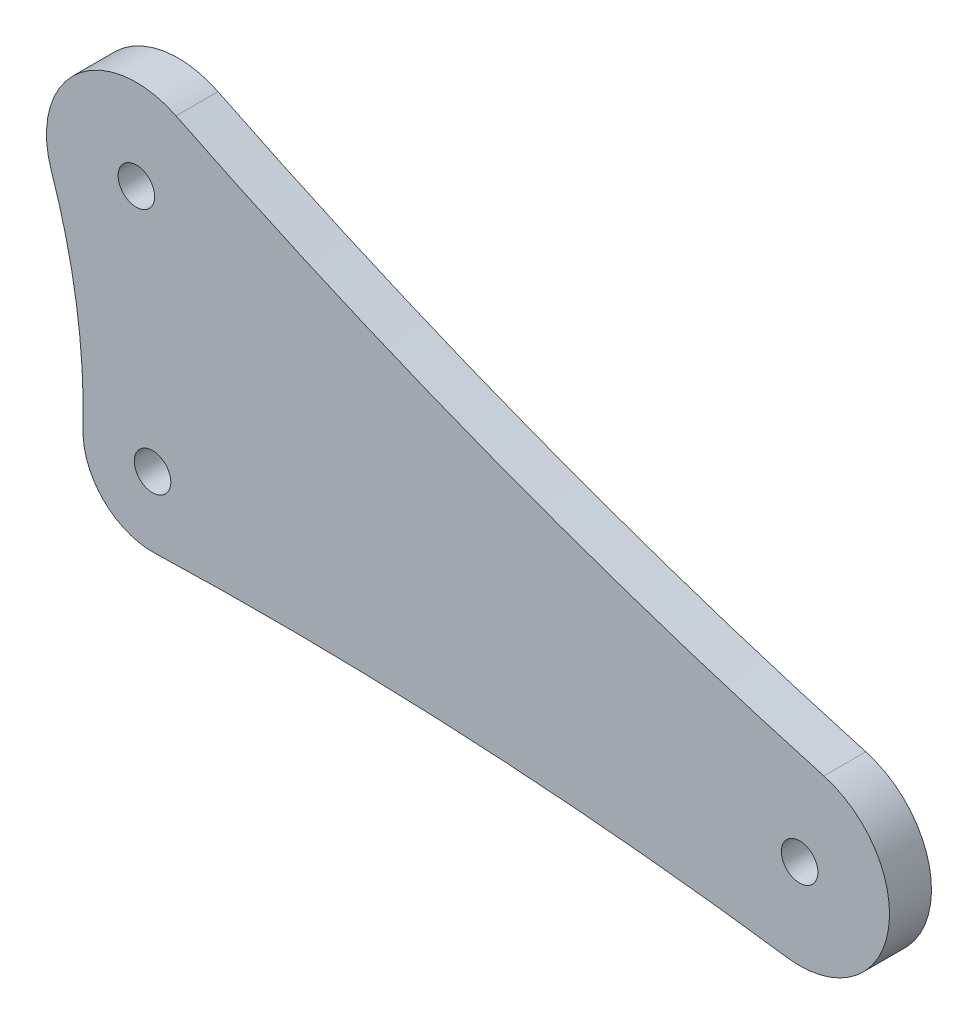
ISO-10303-21;
HEADER;
FILE_DESCRIPTION(('STEP AP214'),'2;1');
FILE_NAME('part.step','',(''),(''),'','','');
FILE_SCHEMA(('AUTOMOTIVE_DESIGN { 1 0 10303 214 1 1 1 1 }'));
ENDSEC;
DATA;
#1=APPLICATION_CONTEXT('core data for automotive mechanical design processes');
#2=APPLICATION_PROTOCOL_DEFINITION('international standard','automotive_design',2000,#1);
#3=PRODUCT_CONTEXT('',#1,'mechanical');
#4=PRODUCT('Part','Part','',(#3));
#5=PRODUCT_RELATED_PRODUCT_CATEGORY('part','',(#4));
#6=PRODUCT_DEFINITION_FORMATION('','',#4);
#7=PRODUCT_DEFINITION_CONTEXT('part definition',#1,'design');
#8=PRODUCT_DEFINITION('design','',#6,#7);
#9=PRODUCT_DEFINITION_SHAPE('','',#8);
#10=(LENGTH_UNIT() NAMED_UNIT(*) SI_UNIT(.MILLI.,.METRE.));
#11=(NAMED_UNIT(*) PLANE_ANGLE_UNIT() SI_UNIT($,.RADIAN.));
#12=(NAMED_UNIT(*) SI_UNIT($,.STERADIAN.) SOLID_ANGLE_UNIT());
#13=UNCERTAINTY_MEASURE_WITH_UNIT(LENGTH_MEASURE(1.E-05),#10,'distance_accuracy_value','');
#14=(GEOMETRIC_REPRESENTATION_CONTEXT(3) GLOBAL_UNCERTAINTY_ASSIGNED_CONTEXT((#13)) GLOBAL_UNIT_ASSIGNED_CONTEXT((#10,
#11,#12)) REPRESENTATION_CONTEXT('',''));
#15=CARTESIAN_POINT('',(0.,0.,0.));
#16=DIRECTION('',(0.,0.,1.));
#17=DIRECTION('',(1.,0.,0.));
#18=AXIS2_PLACEMENT_3D('',#15,#16,#17);
#19=CARTESIAN_POINT('',(-27.8909298418944,0.711359652022852,3.5));
#20=DIRECTION('',(0.,0.,-1.));
#21=DIRECTION('',(-1.,0.,0.));
#22=AXIS2_PLACEMENT_3D('',#19,#20,#21);
#23=PLANE('',#22);
#24=CARTESIAN_POINT('',(-55.7818596837888,1.4227193040457,3.5));
#25=DIRECTION('',(0.,0.,-1.));
#26=DIRECTION('',(-1.,0.,0.));
#27=AXIS2_PLACEMENT_3D('',#24,#25,#26);
#28=CIRCLE('',#27,50.);
#29=CARTESIAN_POINT('',(-8.44980778484198,17.5372116334805,3.5));
#30=VERTEX_POINT('',#29);
#31=CARTESIAN_POINT('',(-5.79811444741889,0.147881217983246,3.5));
#32=VERTEX_POINT('',#31);
#33=EDGE_CURVE('E130',#30,#32,#28,.T.);
#34=ORIENTED_EDGE('',*,*,#33,.T.);
#35=CARTESIAN_POINT('',(0.,0.,3.5));
#36=DIRECTION('',(0.,0.,1.));
#37=DIRECTION('',(1.,0.,0.));
#38=AXIS2_PLACEMENT_3D('',#35,#36,#37);
#39=CIRCLE('',#38,5.79999999999999);
#40=CARTESIAN_POINT('',(0.175497636745727,-5.79734426953377,3.5));
#41=VERTEX_POINT('',#40);
#42=EDGE_CURVE('E88',#32,#41,#39,.T.);
#43=ORIENTED_EDGE('',*,*,#42,.T.);
#44=CARTESIAN_POINT('',(9.70683480483169,-320.653110632147,3.5));
#45=DIRECTION('',(0.,0.,-1.));
#46=DIRECTION('',(1.,0.,0.));
#47=AXIS2_PLACEMENT_3D('',#44,#45,#46);
#48=CIRCLE('',#47,315.);
#49=CARTESIAN_POINT('',(52.9567403442984,-8.63637122410267,3.5));
#50=VERTEX_POINT('',#49);
#51=EDGE_CURVE('E101',#41,#50,#48,.T.);
#52=ORIENTED_EDGE('',*,*,#51,.T.);
#53=CARTESIAN_POINT('',(53.9865,-1.2074012381969,3.5));
#54=DIRECTION('',(0.,0.,1.));
#55=DIRECTION('',(1.,0.,0.));
#56=AXIS2_PLACEMENT_3D('',#53,#54,#55);
#57=CIRCLE('',#56,7.49999999999996);
#58=CARTESIAN_POINT('',(56.0106685497038,6.0142842771374,3.5));
#59=VERTEX_POINT('',#58);
#60=EDGE_CURVE('E95',#50,#59,#57,.T.);
#61=ORIENTED_EDGE('',*,*,#60,.T.);
#62=CARTESIAN_POINT('',(141.02574763727,309.325075921179,3.5));
#63=DIRECTION('',(0.,0.,-1.));
#64=DIRECTION('',(1.,0.,0.));
#65=AXIS2_PLACEMENT_3D('',#62,#63,#64);
#66=CIRCLE('',#65,315.);
#67=CARTESIAN_POINT('',(1.96106389854113,26.6839364233209,3.5));
#68=VERTEX_POINT('',#67);
#69=EDGE_CURVE('E99',#59,#68,#66,.T.);
#70=ORIENTED_EDGE('',*,*,#69,.T.);
#71=CARTESIAN_POINT('',(-1.35,19.9543854828957,3.5));
#72=DIRECTION('',(0.,0.,1.));
#73=DIRECTION('',(1.,0.,0.));
#74=AXIS2_PLACEMENT_3D('',#71,#72,#73);
#75=CIRCLE('',#74,7.49999999999997);
#76=EDGE_CURVE('E51',#68,#30,#75,.T.);
#77=ORIENTED_EDGE('',*,*,#76,.T.);
#78=EDGE_LOOP('',(#34,#43,#52,#61,#70,#77));
#79=FACE_BOUND('',#78,.T.);
#80=CARTESIAN_POINT('',(0.,0.,3.5));
#81=DIRECTION('',(0.,0.,1.));
#82=DIRECTION('',(1.,0.,0.));
#83=AXIS2_PLACEMENT_3D('',#80,#81,#82);
#84=CIRCLE('',#83,1.525);
#85=CARTESIAN_POINT('',(1.525,0.,3.5));
#86=VERTEX_POINT('',#85);
#87=EDGE_CURVE('E123',#86,#86,#84,.T.);
#88=ORIENTED_EDGE('',*,*,#87,.F.);
#89=EDGE_LOOP('',(#88));
#90=FACE_BOUND('',#89,.T.);
#91=CARTESIAN_POINT('',(-1.35,19.9543854828957,3.5));
#92=DIRECTION('',(0.,0.,1.));
#93=DIRECTION('',(1.,0.,0.));
#94=AXIS2_PLACEMENT_3D('',#91,#92,#93);
#95=CIRCLE('',#94,1.525);
#96=CARTESIAN_POINT('',(0.174999999999997,19.9543854828957,3.5));
#97=VERTEX_POINT('',#96);
#98=EDGE_CURVE('E184',#97,#97,#95,.T.);
#99=ORIENTED_EDGE('',*,*,#98,.F.);
#100=EDGE_LOOP('',(#99));
#101=FACE_BOUND('',#100,.T.);
#102=CARTESIAN_POINT('',(53.9865,-1.2074012381969,3.5));
#103=DIRECTION('',(0.,0.,1.));
#104=DIRECTION('',(1.,0.,0.));
#105=AXIS2_PLACEMENT_3D('',#102,#103,#104);
#106=CIRCLE('',#105,1.525);
#107=CARTESIAN_POINT('',(55.5115,-1.2074012381969,3.5));
#108=VERTEX_POINT('',#107);
#109=EDGE_CURVE('E175',#108,#108,#106,.T.);
#110=ORIENTED_EDGE('',*,*,#109,.F.);
#111=EDGE_LOOP('',(#110));
#112=FACE_BOUND('',#111,.T.);
#113=ADVANCED_FACE('F34',(#79,#90,#101,#112),#23,.F.);
#114=CARTESIAN_POINT('',(-27.8909298418944,0.711359652022852,0.));
#115=DIRECTION('',(0.,0.,-1.));
#116=DIRECTION('',(-1.,0.,0.));
#117=AXIS2_PLACEMENT_3D('',#114,#115,#116);
#118=PLANE('',#117);
#119=CARTESIAN_POINT('',(-1.35,19.9543854828957,0.));
#120=DIRECTION('',(0.,0.,1.));
#121=DIRECTION('',(1.,0.,0.));
#122=AXIS2_PLACEMENT_3D('',#119,#120,#121);
#123=CIRCLE('',#122,1.525);
#124=CARTESIAN_POINT('',(0.174999999999997,19.9543854828957,0.));
#125=VERTEX_POINT('',#124);
#126=EDGE_CURVE('E181',#125,#125,#123,.T.);
#127=ORIENTED_EDGE('',*,*,#126,.T.);
#128=EDGE_LOOP('',(#127));
#129=FACE_BOUND('',#128,.T.);
#130=CARTESIAN_POINT('',(-55.7818596837888,1.4227193040457,0.));
#131=DIRECTION('',(0.,0.,-1.));
#132=DIRECTION('',(-1.,0.,0.));
#133=AXIS2_PLACEMENT_3D('',#130,#131,#132);
#134=CIRCLE('',#133,50.);
#135=CARTESIAN_POINT('',(-8.44980778484198,17.5372116334805,0.));
#136=VERTEX_POINT('',#135);
#137=CARTESIAN_POINT('',(-5.79811444741889,0.147881217983246,0.));
#138=VERTEX_POINT('',#137);
#139=EDGE_CURVE('E119',#136,#138,#134,.T.);
#140=ORIENTED_EDGE('',*,*,#139,.F.);
#141=CARTESIAN_POINT('',(-1.35,19.9543854828957,0.));
#142=DIRECTION('',(0.,0.,1.));
#143=DIRECTION('',(1.,0.,0.));
#144=AXIS2_PLACEMENT_3D('',#141,#142,#143);
#145=CIRCLE('',#144,7.49999999999997);
#146=CARTESIAN_POINT('',(1.96106389854113,26.6839364233209,0.));
#147=VERTEX_POINT('',#146);
#148=EDGE_CURVE('E80',#147,#136,#145,.T.);
#149=ORIENTED_EDGE('',*,*,#148,.F.);
#150=CARTESIAN_POINT('',(141.02574763727,309.325075921179,0.));
#151=DIRECTION('',(0.,0.,-1.));
#152=DIRECTION('',(1.,0.,0.));
#153=AXIS2_PLACEMENT_3D('',#150,#151,#152);
#154=CIRCLE('',#153,315.);
#155=CARTESIAN_POINT('',(56.0106685497038,6.0142842771374,0.));
#156=VERTEX_POINT('',#155);
#157=EDGE_CURVE('E74',#156,#147,#154,.T.);
#158=ORIENTED_EDGE('',*,*,#157,.F.);
#159=CARTESIAN_POINT('',(53.9865,-1.2074012381969,0.));
#160=DIRECTION('',(0.,0.,1.));
#161=DIRECTION('',(1.,0.,0.));
#162=AXIS2_PLACEMENT_3D('',#159,#160,#161);
#163=CIRCLE('',#162,7.49999999999996);
#164=CARTESIAN_POINT('',(52.9567403442984,-8.63637122410267,0.));
#165=VERTEX_POINT('',#164);
#166=EDGE_CURVE('E109',#165,#156,#163,.T.);
#167=ORIENTED_EDGE('',*,*,#166,.F.);
#168=CARTESIAN_POINT('',(9.70683480483169,-320.653110632147,0.));
#169=DIRECTION('',(0.,0.,-1.));
#170=DIRECTION('',(1.,0.,0.));
#171=AXIS2_PLACEMENT_3D('',#168,#169,#170);
#172=CIRCLE('',#171,315.);
#173=CARTESIAN_POINT('',(0.175497636745727,-5.79734426953377,0.));
#174=VERTEX_POINT('',#173);
#175=EDGE_CURVE('E125',#174,#165,#172,.T.);
#176=ORIENTED_EDGE('',*,*,#175,.F.);
#177=CARTESIAN_POINT('',(0.,0.,0.));
#178=DIRECTION('',(0.,0.,1.));
#179=DIRECTION('',(1.,0.,0.));
#180=AXIS2_PLACEMENT_3D('',#177,#178,#179);
#181=CIRCLE('',#180,5.79999999999999);
#182=EDGE_CURVE('E122',#138,#174,#181,.T.);
#183=ORIENTED_EDGE('',*,*,#182,.F.);
#184=EDGE_LOOP('',(#140,#149,#158,#167,#176,#183));
#185=FACE_BOUND('',#184,.T.);
#186=CARTESIAN_POINT('',(0.,0.,0.));
#187=DIRECTION('',(0.,0.,1.));
#188=DIRECTION('',(1.,0.,0.));
#189=AXIS2_PLACEMENT_3D('',#186,#187,#188);
#190=CIRCLE('',#189,1.525);
#191=CARTESIAN_POINT('',(1.525,0.,0.));
#192=VERTEX_POINT('',#191);
#193=EDGE_CURVE('E187',#192,#192,#190,.T.);
#194=ORIENTED_EDGE('',*,*,#193,.T.);
#195=EDGE_LOOP('',(#194));
#196=FACE_BOUND('',#195,.T.);
#197=CARTESIAN_POINT('',(53.9865,-1.2074012381969,0.));
#198=DIRECTION('',(0.,0.,1.));
#199=DIRECTION('',(1.,0.,0.));
#200=AXIS2_PLACEMENT_3D('',#197,#198,#199);
#201=CIRCLE('',#200,1.525);
#202=CARTESIAN_POINT('',(55.5115,-1.2074012381969,0.));
#203=VERTEX_POINT('',#202);
#204=EDGE_CURVE('E178',#203,#203,#201,.T.);
#205=ORIENTED_EDGE('',*,*,#204,.T.);
#206=EDGE_LOOP('',(#205));
#207=FACE_BOUND('',#206,.T.);
#208=ADVANCED_FACE('F139',(#129,#185,#196,#207),#118,.T.);
#209=CARTESIAN_POINT('',(-55.7818596837888,1.4227193040457,3.5));
#210=DIRECTION('',(0.,0.,-1.));
#211=DIRECTION('',(-1.,0.,0.));
#212=AXIS2_PLACEMENT_3D('',#209,#210,#211);
#213=CYLINDRICAL_SURFACE('',#212,50.);
#214=ORIENTED_EDGE('',*,*,#139,.T.);
#215=DIRECTION('',(0.,0.,-1.));
#216=VECTOR('',#215,1.);
#217=CARTESIAN_POINT('',(-5.79811444741889,0.147881217983246,3.5));
#218=LINE('',#217,#216);
#219=EDGE_CURVE('E11',#32,#138,#218,.T.);
#220=ORIENTED_EDGE('',*,*,#219,.F.);
#221=ORIENTED_EDGE('',*,*,#33,.F.);
#222=DIRECTION('',(0.,0.,-1.));
#223=VECTOR('',#222,1.);
#224=CARTESIAN_POINT('',(-8.44980778484198,17.5372116334805,3.5));
#225=LINE('',#224,#223);
#226=EDGE_CURVE('E115',#30,#136,#225,.T.);
#227=ORIENTED_EDGE('',*,*,#226,.T.);
#228=EDGE_LOOP('',(#214,#220,#221,#227));
#229=FACE_BOUND('',#228,.T.);
#230=ADVANCED_FACE('F36',(#229),#213,.F.);
#231=CARTESIAN_POINT('',(0.,0.,3.5));
#232=DIRECTION('',(0.,0.,-1.));
#233=DIRECTION('',(-1.,0.,0.));
#234=AXIS2_PLACEMENT_3D('',#231,#232,#233);
#235=CYLINDRICAL_SURFACE('',#234,5.79999999999999);
#236=ORIENTED_EDGE('',*,*,#182,.T.);
#237=DIRECTION('',(0.,0.,-1.));
#238=VECTOR('',#237,1.);
#239=CARTESIAN_POINT('',(0.175497636745727,-5.79734426953377,3.5));
#240=LINE('',#239,#238);
#241=EDGE_CURVE('E43',#41,#174,#240,.T.);
#242=ORIENTED_EDGE('',*,*,#241,.F.);
#243=ORIENTED_EDGE('',*,*,#42,.F.);
#244=ORIENTED_EDGE('',*,*,#219,.T.);
#245=EDGE_LOOP('',(#236,#242,#243,#244));
#246=FACE_BOUND('',#245,.T.);
#247=ADVANCED_FACE('F238',(#246),#235,.T.);
#248=CARTESIAN_POINT('',(9.70683480483169,-320.653110632147,3.5));
#249=DIRECTION('',(0.,0.,-1.));
#250=DIRECTION('',(-1.,0.,0.));
#251=AXIS2_PLACEMENT_3D('',#248,#249,#250);
#252=CYLINDRICAL_SURFACE('',#251,315.);
#253=ORIENTED_EDGE('',*,*,#175,.T.);
#254=DIRECTION('',(0.,0.,-1.));
#255=VECTOR('',#254,1.);
#256=CARTESIAN_POINT('',(52.9567403442984,-8.63637122410267,3.5));
#257=LINE('',#256,#255);
#258=EDGE_CURVE('E110',#50,#165,#257,.T.);
#259=ORIENTED_EDGE('',*,*,#258,.F.);
#260=ORIENTED_EDGE('',*,*,#51,.F.);
#261=ORIENTED_EDGE('',*,*,#241,.T.);
#262=EDGE_LOOP('',(#253,#259,#260,#261));
#263=FACE_BOUND('',#262,.T.);
#264=ADVANCED_FACE('F136',(#263),#252,.F.);
#265=CARTESIAN_POINT('',(53.9865,-1.2074012381969,3.5));
#266=DIRECTION('',(0.,0.,-1.));
#267=DIRECTION('',(-1.,0.,0.));
#268=AXIS2_PLACEMENT_3D('',#265,#266,#267);
#269=CYLINDRICAL_SURFACE('',#268,7.49999999999996);
#270=ORIENTED_EDGE('',*,*,#166,.T.);
#271=DIRECTION('',(0.,0.,-1.));
#272=VECTOR('',#271,1.);
#273=CARTESIAN_POINT('',(56.0106685497038,6.0142842771374,3.5));
#274=LINE('',#273,#272);
#275=EDGE_CURVE('E106',#59,#156,#274,.T.);
#276=ORIENTED_EDGE('',*,*,#275,.F.);
#277=ORIENTED_EDGE('',*,*,#60,.F.);
#278=ORIENTED_EDGE('',*,*,#258,.T.);
#279=EDGE_LOOP('',(#270,#276,#277,#278));
#280=FACE_BOUND('',#279,.T.);
#281=ADVANCED_FACE('F107',(#280),#269,.T.);
#282=CARTESIAN_POINT('',(141.02574763727,309.325075921179,3.5));
#283=DIRECTION('',(0.,0.,-1.));
#284=DIRECTION('',(-1.,0.,0.));
#285=AXIS2_PLACEMENT_3D('',#282,#283,#284);
#286=CYLINDRICAL_SURFACE('',#285,315.);
#287=ORIENTED_EDGE('',*,*,#157,.T.);
#288=DIRECTION('',(0.,0.,-1.));
#289=VECTOR('',#288,1.);
#290=CARTESIAN_POINT('',(1.96106389854113,26.6839364233209,3.5));
#291=LINE('',#290,#289);
#292=EDGE_CURVE('E111',#68,#147,#291,.T.);
#293=ORIENTED_EDGE('',*,*,#292,.F.);
#294=ORIENTED_EDGE('',*,*,#69,.F.);
#295=ORIENTED_EDGE('',*,*,#275,.T.);
#296=EDGE_LOOP('',(#287,#293,#294,#295));
#297=FACE_BOUND('',#296,.T.);
#298=ADVANCED_FACE('F113',(#297),#286,.F.);
#299=CARTESIAN_POINT('',(-1.35,19.9543854828957,3.5));
#300=DIRECTION('',(0.,0.,-1.));
#301=DIRECTION('',(-1.,0.,0.));
#302=AXIS2_PLACEMENT_3D('',#299,#300,#301);
#303=CYLINDRICAL_SURFACE('',#302,7.49999999999997);
#304=ORIENTED_EDGE('',*,*,#148,.T.);
#305=ORIENTED_EDGE('',*,*,#226,.F.);
#306=ORIENTED_EDGE('',*,*,#76,.F.);
#307=ORIENTED_EDGE('',*,*,#292,.T.);
#308=EDGE_LOOP('',(#304,#305,#306,#307));
#309=FACE_BOUND('',#308,.T.);
#310=ADVANCED_FACE('F144',(#309),#303,.T.);
#311=CARTESIAN_POINT('',(0.,0.,3.5));
#312=DIRECTION('',(0.,0.,-1.));
#313=DIRECTION('',(-1.,0.,0.));
#314=AXIS2_PLACEMENT_3D('',#311,#312,#313);
#315=CYLINDRICAL_SURFACE('',#314,1.525);
#316=ORIENTED_EDGE('',*,*,#87,.T.);
#317=EDGE_LOOP('',(#316));
#318=FACE_BOUND('',#317,.T.);
#319=ORIENTED_EDGE('',*,*,#193,.F.);
#320=EDGE_LOOP('',(#319));
#321=FACE_BOUND('',#320,.T.);
#322=ADVANCED_FACE('F146',(#318,#321),#315,.F.);
#323=CARTESIAN_POINT('',(-1.35,19.9543854828957,3.5));
#324=DIRECTION('',(0.,0.,-1.));
#325=DIRECTION('',(-1.,0.,0.));
#326=AXIS2_PLACEMENT_3D('',#323,#324,#325);
#327=CYLINDRICAL_SURFACE('',#326,1.525);
#328=ORIENTED_EDGE('',*,*,#98,.T.);
#329=EDGE_LOOP('',(#328));
#330=FACE_BOUND('',#329,.T.);
#331=ORIENTED_EDGE('',*,*,#126,.F.);
#332=EDGE_LOOP('',(#331));
#333=FACE_BOUND('',#332,.T.);
#334=ADVANCED_FACE('F152',(#330,#333),#327,.F.);
#335=CARTESIAN_POINT('',(53.9865,-1.2074012381969,3.5));
#336=DIRECTION('',(0.,0.,-1.));
#337=DIRECTION('',(-1.,0.,0.));
#338=AXIS2_PLACEMENT_3D('',#335,#336,#337);
#339=CYLINDRICAL_SURFACE('',#338,1.525);
#340=ORIENTED_EDGE('',*,*,#109,.T.);
#341=EDGE_LOOP('',(#340));
#342=FACE_BOUND('',#341,.T.);
#343=ORIENTED_EDGE('',*,*,#204,.F.);
#344=EDGE_LOOP('',(#343));
#345=FACE_BOUND('',#344,.T.);
#346=ADVANCED_FACE('F166',(#342,#345),#339,.F.);
#347=CLOSED_SHELL('',(#113,#208,#230,#247,#264,#281,#298,#310,#322,#334,#346));
#348=MANIFOLD_SOLID_BREP('B2',#347);
#349=ADVANCED_BREP_SHAPE_REPRESENTATION('',(#18,#348),#14);
#350=SHAPE_DEFINITION_REPRESENTATION(#9,#349);
ENDSEC;
END-ISO-10303-21;
